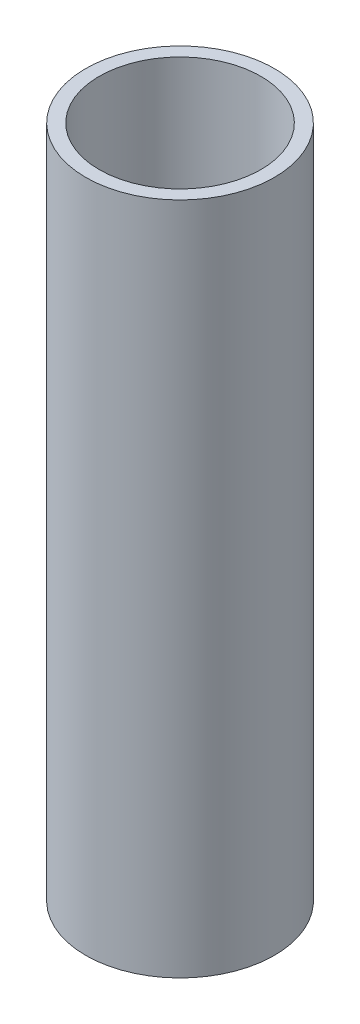
ISO-10303-21;
HEADER;
FILE_DESCRIPTION(('STEP AP214'),'2;1');
FILE_NAME('part.step','',(''),(''),'','','');
FILE_SCHEMA(('AUTOMOTIVE_DESIGN { 1 0 10303 214 1 1 1 1 }'));
ENDSEC;
DATA;
#1=APPLICATION_CONTEXT('core data for automotive mechanical design processes');
#2=APPLICATION_PROTOCOL_DEFINITION('international standard','automotive_design',2000,#1);
#3=PRODUCT_CONTEXT('',#1,'mechanical');
#4=PRODUCT('Part','Part','',(#3));
#5=PRODUCT_RELATED_PRODUCT_CATEGORY('part','',(#4));
#6=PRODUCT_DEFINITION_FORMATION('','',#4);
#7=PRODUCT_DEFINITION_CONTEXT('part definition',#1,'design');
#8=PRODUCT_DEFINITION('design','',#6,#7);
#9=PRODUCT_DEFINITION_SHAPE('','',#8);
#10=(LENGTH_UNIT() NAMED_UNIT(*) SI_UNIT(.MILLI.,.METRE.));
#11=(NAMED_UNIT(*) PLANE_ANGLE_UNIT() SI_UNIT($,.RADIAN.));
#12=(NAMED_UNIT(*) SI_UNIT($,.STERADIAN.) SOLID_ANGLE_UNIT());
#13=UNCERTAINTY_MEASURE_WITH_UNIT(LENGTH_MEASURE(1.E-05),#10,'distance_accuracy_value','');
#14=(GEOMETRIC_REPRESENTATION_CONTEXT(3) GLOBAL_UNCERTAINTY_ASSIGNED_CONTEXT((#13)) GLOBAL_UNIT_ASSIGNED_CONTEXT((#10,
#11,#12)) REPRESENTATION_CONTEXT('',''));
#15=CARTESIAN_POINT('',(0.,0.,0.));
#16=DIRECTION('',(0.,0.,1.));
#17=DIRECTION('',(1.,0.,0.));
#18=AXIS2_PLACEMENT_3D('',#15,#16,#17);
#19=CARTESIAN_POINT('',(0.,50.,0.));
#20=DIRECTION('',(0.,1.,0.));
#21=DIRECTION('',(0.,0.,1.));
#22=AXIS2_PLACEMENT_3D('',#19,#20,#21);
#23=PLANE('',#22);
#24=CARTESIAN_POINT('',(0.,50.,0.));
#25=DIRECTION('',(0.,1.,0.));
#26=DIRECTION('',(0.,0.,1.));
#27=AXIS2_PLACEMENT_3D('',#24,#25,#26);
#28=CIRCLE('',#27,7.);
#29=CARTESIAN_POINT('',(0.,50.,7.));
#30=VERTEX_POINT('',#29);
#31=EDGE_CURVE('E10',#30,#30,#28,.T.);
#32=ORIENTED_EDGE('',*,*,#31,.T.);
#33=EDGE_LOOP('',(#32));
#34=FACE_BOUND('',#33,.T.);
#35=CARTESIAN_POINT('',(0.,50.,0.));
#36=DIRECTION('',(0.,1.,0.));
#37=DIRECTION('',(0.,0.,1.));
#38=AXIS2_PLACEMENT_3D('',#35,#36,#37);
#39=CIRCLE('',#38,6.);
#40=CARTESIAN_POINT('',(0.,50.,6.));
#41=VERTEX_POINT('',#40);
#42=EDGE_CURVE('E41',#41,#41,#39,.T.);
#43=ORIENTED_EDGE('',*,*,#42,.F.);
#44=EDGE_LOOP('',(#43));
#45=FACE_BOUND('',#44,.T.);
#46=ADVANCED_FACE('F30',(#34,#45),#23,.T.);
#47=CARTESIAN_POINT('',(0.,0.,0.));
#48=DIRECTION('',(0.,1.,0.));
#49=DIRECTION('',(0.,0.,1.));
#50=AXIS2_PLACEMENT_3D('',#47,#48,#49);
#51=PLANE('',#50);
#52=CARTESIAN_POINT('',(0.,0.,0.));
#53=DIRECTION('',(0.,1.,0.));
#54=DIRECTION('',(0.,0.,1.));
#55=AXIS2_PLACEMENT_3D('',#52,#53,#54);
#56=CIRCLE('',#55,7.);
#57=CARTESIAN_POINT('',(0.,0.,7.));
#58=VERTEX_POINT('',#57);
#59=EDGE_CURVE('E34',#58,#58,#56,.T.);
#60=ORIENTED_EDGE('',*,*,#59,.F.);
#61=EDGE_LOOP('',(#60));
#62=FACE_BOUND('',#61,.T.);
#63=CARTESIAN_POINT('',(0.,0.,0.));
#64=DIRECTION('',(0.,1.,0.));
#65=DIRECTION('',(0.,0.,1.));
#66=AXIS2_PLACEMENT_3D('',#63,#64,#65);
#67=CIRCLE('',#66,6.);
#68=CARTESIAN_POINT('',(0.,0.,6.));
#69=VERTEX_POINT('',#68);
#70=EDGE_CURVE('E43',#69,#69,#67,.T.);
#71=ORIENTED_EDGE('',*,*,#70,.T.);
#72=EDGE_LOOP('',(#71));
#73=FACE_BOUND('',#72,.T.);
#74=ADVANCED_FACE('F53',(#62,#73),#51,.F.);
#75=CARTESIAN_POINT('',(0.,50.,0.));
#76=DIRECTION('',(0.,-1.,0.));
#77=DIRECTION('',(0.,0.,-1.));
#78=AXIS2_PLACEMENT_3D('',#75,#76,#77);
#79=CYLINDRICAL_SURFACE('',#78,7.);
#80=ORIENTED_EDGE('',*,*,#31,.F.);
#81=EDGE_LOOP('',(#80));
#82=FACE_BOUND('',#81,.T.);
#83=ORIENTED_EDGE('',*,*,#59,.T.);
#84=EDGE_LOOP('',(#83));
#85=FACE_BOUND('',#84,.T.);
#86=ADVANCED_FACE('F32',(#82,#85),#79,.T.);
#87=CARTESIAN_POINT('',(0.,50.,0.));
#88=DIRECTION('',(0.,-1.,0.));
#89=DIRECTION('',(0.,0.,-1.));
#90=AXIS2_PLACEMENT_3D('',#87,#88,#89);
#91=CYLINDRICAL_SURFACE('',#90,6.);
#92=ORIENTED_EDGE('',*,*,#42,.T.);
#93=EDGE_LOOP('',(#92));
#94=FACE_BOUND('',#93,.T.);
#95=ORIENTED_EDGE('',*,*,#70,.F.);
#96=EDGE_LOOP('',(#95));
#97=FACE_BOUND('',#96,.T.);
#98=ADVANCED_FACE('F49',(#94,#97),#91,.F.);
#99=CLOSED_SHELL('',(#46,#74,#86,#98));
#100=MANIFOLD_SOLID_BREP('B2',#99);
#101=ADVANCED_BREP_SHAPE_REPRESENTATION('',(#18,#100),#14);
#102=SHAPE_DEFINITION_REPRESENTATION(#9,#101);
ENDSEC;
END-ISO-10303-21;
